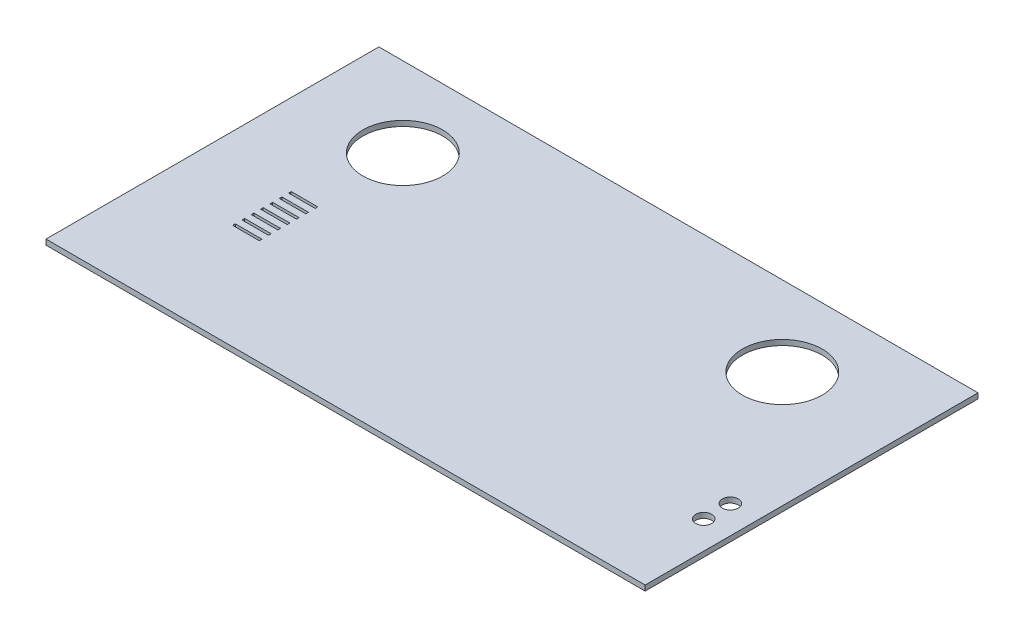
ISO-10303-21;
HEADER;
FILE_DESCRIPTION(('STEP AP214'),'2;1');
FILE_NAME('part.step','',(''),(''),'','','');
FILE_SCHEMA(('AUTOMOTIVE_DESIGN { 1 0 10303 214 1 1 1 1 }'));
ENDSEC;
DATA;
#1=APPLICATION_CONTEXT('core data for automotive mechanical design processes');
#2=APPLICATION_PROTOCOL_DEFINITION('international standard','automotive_design',2000,#1);
#3=PRODUCT_CONTEXT('',#1,'mechanical');
#4=PRODUCT('Part','Part','',(#3));
#5=PRODUCT_RELATED_PRODUCT_CATEGORY('part','',(#4));
#6=PRODUCT_DEFINITION_FORMATION('','',#4);
#7=PRODUCT_DEFINITION_CONTEXT('part definition',#1,'design');
#8=PRODUCT_DEFINITION('design','',#6,#7);
#9=PRODUCT_DEFINITION_SHAPE('','',#8);
#10=(LENGTH_UNIT() NAMED_UNIT(*) SI_UNIT(.MILLI.,.METRE.));
#11=(NAMED_UNIT(*) PLANE_ANGLE_UNIT() SI_UNIT($,.RADIAN.));
#12=(NAMED_UNIT(*) SI_UNIT($,.STERADIAN.) SOLID_ANGLE_UNIT());
#13=UNCERTAINTY_MEASURE_WITH_UNIT(LENGTH_MEASURE(1.E-05),#10,'distance_accuracy_value','');
#14=(GEOMETRIC_REPRESENTATION_CONTEXT(3) GLOBAL_UNCERTAINTY_ASSIGNED_CONTEXT((#13)) GLOBAL_UNIT_ASSIGNED_CONTEXT((#10,
#11,#12)) REPRESENTATION_CONTEXT('',''));
#15=CARTESIAN_POINT('',(0.,0.,0.));
#16=DIRECTION('',(0.,0.,1.));
#17=DIRECTION('',(1.,0.,0.));
#18=AXIS2_PLACEMENT_3D('',#15,#16,#17);
#19=CARTESIAN_POINT('',(0.,4.,0.));
#20=DIRECTION('',(0.,1.,0.));
#21=DIRECTION('',(0.,0.,1.));
#22=AXIS2_PLACEMENT_3D('',#19,#20,#21);
#23=PLANE('',#22);
#24=DIRECTION('',(0.,0.,1.));
#25=VECTOR('',#24,1.);
#26=CARTESIAN_POINT('',(61.17,4.,-123.));
#27=LINE('',#26,#25);
#28=CARTESIAN_POINT('',(61.17,4.,-123.));
#29=VERTEX_POINT('',#28);
#30=CARTESIAN_POINT('',(61.17,4.,-121.));
#31=VERTEX_POINT('',#30);
#32=EDGE_CURVE('E120',#29,#31,#27,.T.);
#33=ORIENTED_EDGE('',*,*,#32,.F.);
#34=DIRECTION('',(-1.,0.,0.));
#35=VECTOR('',#34,1.);
#36=CARTESIAN_POINT('',(81.17,4.,-123.));
#37=LINE('',#36,#35);
#38=CARTESIAN_POINT('',(81.17,4.,-123.));
#39=VERTEX_POINT('',#38);
#40=EDGE_CURVE('E428',#39,#29,#37,.T.);
#41=ORIENTED_EDGE('',*,*,#40,.F.);
#42=DIRECTION('',(0.,0.,-1.));
#43=VECTOR('',#42,1.);
#44=CARTESIAN_POINT('',(81.17,4.,-121.));
#45=LINE('',#44,#43);
#46=CARTESIAN_POINT('',(81.17,4.,-121.));
#47=VERTEX_POINT('',#46);
#48=EDGE_CURVE('E431',#47,#39,#45,.T.);
#49=ORIENTED_EDGE('',*,*,#48,.F.);
#50=DIRECTION('',(1.,0.,0.));
#51=VECTOR('',#50,1.);
#52=CARTESIAN_POINT('',(61.17,4.,-121.));
#53=LINE('',#52,#51);
#54=EDGE_CURVE('E435',#31,#47,#53,.T.);
#55=ORIENTED_EDGE('',*,*,#54,.F.);
#56=EDGE_LOOP('',(#33,#41,#49,#55));
#57=FACE_BOUND('',#56,.T.);
#58=DIRECTION('',(0.,0.,-1.));
#59=VECTOR('',#58,1.);
#60=CARTESIAN_POINT('',(81.17,4.,0.));
#61=LINE('',#60,#59);
#62=CARTESIAN_POINT('',(81.17,4.,-79.));
#63=VERTEX_POINT('',#62);
#64=CARTESIAN_POINT('',(81.17,4.,-81.));
#65=VERTEX_POINT('',#64);
#66=EDGE_CURVE('E128',#63,#65,#61,.T.);
#67=ORIENTED_EDGE('',*,*,#66,.F.);
#68=DIRECTION('',(1.,0.,0.));
#69=VECTOR('',#68,1.);
#70=CARTESIAN_POINT('',(0.,4.,-79.));
#71=LINE('',#70,#69);
#72=CARTESIAN_POINT('',(61.17,4.,-79.));
#73=VERTEX_POINT('',#72);
#74=EDGE_CURVE('E396',#73,#63,#71,.T.);
#75=ORIENTED_EDGE('',*,*,#74,.F.);
#76=DIRECTION('',(0.,0.,1.));
#77=VECTOR('',#76,1.);
#78=CARTESIAN_POINT('',(61.17,4.,0.));
#79=LINE('',#78,#77);
#80=CARTESIAN_POINT('',(61.17,4.,-81.));
#81=VERTEX_POINT('',#80);
#82=EDGE_CURVE('E399',#81,#73,#79,.T.);
#83=ORIENTED_EDGE('',*,*,#82,.F.);
#84=DIRECTION('',(-1.,0.,0.));
#85=VECTOR('',#84,1.);
#86=CARTESIAN_POINT('',(0.,4.,-81.));
#87=LINE('',#86,#85);
#88=EDGE_CURVE('E403',#65,#81,#87,.T.);
#89=ORIENTED_EDGE('',*,*,#88,.F.);
#90=EDGE_LOOP('',(#67,#75,#83,#89));
#91=FACE_BOUND('',#90,.T.);
#92=DIRECTION('',(1.,0.,0.));
#93=VECTOR('',#92,1.);
#94=CARTESIAN_POINT('',(0.,4.,-86.));
#95=LINE('',#94,#93);
#96=CARTESIAN_POINT('',(61.17,4.,-86.));
#97=VERTEX_POINT('',#96);
#98=CARTESIAN_POINT('',(81.17,4.,-86.));
#99=VERTEX_POINT('',#98);
#100=EDGE_CURVE('E459',#97,#99,#95,.T.);
#101=ORIENTED_EDGE('',*,*,#100,.F.);
#102=DIRECTION('',(0.,0.,1.));
#103=VECTOR('',#102,1.);
#104=CARTESIAN_POINT('',(61.17,4.,0.));
#105=LINE('',#104,#103);
#106=CARTESIAN_POINT('',(61.17,4.,-88.));
#107=VERTEX_POINT('',#106);
#108=EDGE_CURVE('E492',#107,#97,#105,.T.);
#109=ORIENTED_EDGE('',*,*,#108,.F.);
#110=DIRECTION('',(-1.,0.,0.));
#111=VECTOR('',#110,1.);
#112=CARTESIAN_POINT('',(0.,4.,-88.));
#113=LINE('',#112,#111);
#114=CARTESIAN_POINT('',(81.17,4.,-88.));
#115=VERTEX_POINT('',#114);
#116=EDGE_CURVE('E495',#115,#107,#113,.T.);
#117=ORIENTED_EDGE('',*,*,#116,.F.);
#118=DIRECTION('',(0.,0.,-1.));
#119=VECTOR('',#118,1.);
#120=CARTESIAN_POINT('',(81.17,4.,0.));
#121=LINE('',#120,#119);
#122=EDGE_CURVE('E499',#99,#115,#121,.T.);
#123=ORIENTED_EDGE('',*,*,#122,.F.);
#124=EDGE_LOOP('',(#101,#109,#117,#123));
#125=FACE_BOUND('',#124,.T.);
#126=DIRECTION('',(1.,0.,0.));
#127=VECTOR('',#126,1.);
#128=CARTESIAN_POINT('',(0.,4.,-100.));
#129=LINE('',#128,#127);
#130=CARTESIAN_POINT('',(61.17,4.,-100.));
#131=VERTEX_POINT('',#130);
#132=CARTESIAN_POINT('',(81.17,4.,-100.));
#133=VERTEX_POINT('',#132);
#134=EDGE_CURVE('E460',#131,#133,#129,.T.);
#135=ORIENTED_EDGE('',*,*,#134,.F.);
#136=DIRECTION('',(0.,0.,1.));
#137=VECTOR('',#136,1.);
#138=CARTESIAN_POINT('',(61.17,4.,0.));
#139=LINE('',#138,#137);
#140=CARTESIAN_POINT('',(61.17,4.,-102.));
#141=VERTEX_POINT('',#140);
#142=EDGE_CURVE('E462',#141,#131,#139,.T.);
#143=ORIENTED_EDGE('',*,*,#142,.F.);
#144=DIRECTION('',(-1.,0.,0.));
#145=VECTOR('',#144,1.);
#146=CARTESIAN_POINT('',(0.,4.,-102.));
#147=LINE('',#146,#145);
#148=CARTESIAN_POINT('',(81.17,4.,-102.));
#149=VERTEX_POINT('',#148);
#150=EDGE_CURVE('E466',#149,#141,#147,.T.);
#151=ORIENTED_EDGE('',*,*,#150,.F.);
#152=DIRECTION('',(0.,0.,-1.));
#153=VECTOR('',#152,1.);
#154=CARTESIAN_POINT('',(81.17,4.,0.));
#155=LINE('',#154,#153);
#156=EDGE_CURVE('E469',#133,#149,#155,.T.);
#157=ORIENTED_EDGE('',*,*,#156,.F.);
#158=EDGE_LOOP('',(#135,#143,#151,#157));
#159=FACE_BOUND('',#158,.T.);
#160=CARTESIAN_POINT('',(429.,4.,-85.));
#161=DIRECTION('',(0.,1.,0.));
#162=DIRECTION('',(0.,0.,1.));
#163=AXIS2_PLACEMENT_3D('',#160,#161,#162);
#164=CIRCLE('',#163,5.99999999999999);
#165=CARTESIAN_POINT('',(429.,4.,-79.0000000000001));
#166=VERTEX_POINT('',#165);
#167=EDGE_CURVE('E427',#166,#166,#164,.T.);
#168=ORIENTED_EDGE('',*,*,#167,.F.);
#169=EDGE_LOOP('',(#168));
#170=FACE_BOUND('',#169,.T.);
#171=CARTESIAN_POINT('',(429.,4.,-65.));
#172=DIRECTION('',(0.,1.,0.));
#173=DIRECTION('',(0.,0.,1.));
#174=AXIS2_PLACEMENT_3D('',#171,#172,#173);
#175=CIRCLE('',#174,5.99999999999999);
#176=CARTESIAN_POINT('',(429.,4.,-59.));
#177=VERTEX_POINT('',#176);
#178=EDGE_CURVE('E342',#177,#177,#175,.T.);
#179=ORIENTED_EDGE('',*,*,#178,.F.);
#180=EDGE_LOOP('',(#179));
#181=FACE_BOUND('',#180,.T.);
#182=DIRECTION('',(1.,0.,0.));
#183=VECTOR('',#182,1.);
#184=CARTESIAN_POINT('',(61.17,4.,-114.));
#185=LINE('',#184,#183);
#186=CARTESIAN_POINT('',(61.17,4.,-114.));
#187=VERTEX_POINT('',#186);
#188=CARTESIAN_POINT('',(81.17,4.,-114.));
#189=VERTEX_POINT('',#188);
#190=EDGE_CURVE('E365',#187,#189,#185,.T.);
#191=ORIENTED_EDGE('',*,*,#190,.F.);
#192=DIRECTION('',(0.,0.,1.));
#193=VECTOR('',#192,1.);
#194=CARTESIAN_POINT('',(61.17,4.,0.));
#195=LINE('',#194,#193);
#196=CARTESIAN_POINT('',(61.17,4.,-116.));
#197=VERTEX_POINT('',#196);
#198=EDGE_CURVE('E361',#197,#187,#195,.T.);
#199=ORIENTED_EDGE('',*,*,#198,.F.);
#200=DIRECTION('',(-1.,0.,0.));
#201=VECTOR('',#200,1.);
#202=CARTESIAN_POINT('',(81.17,4.,-116.));
#203=LINE('',#202,#201);
#204=CARTESIAN_POINT('',(81.17,4.,-116.));
#205=VERTEX_POINT('',#204);
#206=EDGE_CURVE('E334',#205,#197,#203,.T.);
#207=ORIENTED_EDGE('',*,*,#206,.F.);
#208=DIRECTION('',(0.,0.,-1.));
#209=VECTOR('',#208,1.);
#210=CARTESIAN_POINT('',(81.17,4.,-114.));
#211=LINE('',#210,#209);
#212=EDGE_CURVE('E362',#189,#205,#211,.T.);
#213=ORIENTED_EDGE('',*,*,#212,.F.);
#214=EDGE_LOOP('',(#191,#199,#207,#213));
#215=FACE_BOUND('',#214,.T.);
#216=DIRECTION('',(0.,0.,1.));
#217=VECTOR('',#216,1.);
#218=CARTESIAN_POINT('',(61.17,4.,-95.));
#219=LINE('',#218,#217);
#220=CARTESIAN_POINT('',(61.17,4.,-95.));
#221=VERTEX_POINT('',#220);
#222=CARTESIAN_POINT('',(61.17,4.,-93.));
#223=VERTEX_POINT('',#222);
#224=EDGE_CURVE('E472',#221,#223,#219,.T.);
#225=ORIENTED_EDGE('',*,*,#224,.F.);
#226=DIRECTION('',(-1.,0.,0.));
#227=VECTOR('',#226,1.);
#228=CARTESIAN_POINT('',(0.,4.,-95.));
#229=LINE('',#228,#227);
#230=CARTESIAN_POINT('',(81.17,4.,-95.));
#231=VERTEX_POINT('',#230);
#232=EDGE_CURVE('E517',#231,#221,#229,.T.);
#233=ORIENTED_EDGE('',*,*,#232,.F.);
#234=DIRECTION('',(0.,0.,-1.));
#235=VECTOR('',#234,1.);
#236=CARTESIAN_POINT('',(81.17,4.,-93.));
#237=LINE('',#236,#235);
#238=CARTESIAN_POINT('',(81.17,4.,-93.));
#239=VERTEX_POINT('',#238);
#240=EDGE_CURVE('E530',#239,#231,#237,.T.);
#241=ORIENTED_EDGE('',*,*,#240,.F.);
#242=DIRECTION('',(1.,0.,0.));
#243=VECTOR('',#242,1.);
#244=CARTESIAN_POINT('',(0.,4.,-93.));
#245=LINE('',#244,#243);
#246=EDGE_CURVE('E521',#223,#239,#245,.T.);
#247=ORIENTED_EDGE('',*,*,#246,.F.);
#248=EDGE_LOOP('',(#225,#233,#241,#247));
#249=FACE_BOUND('',#248,.T.);
#250=CARTESIAN_POINT('',(78.,4.,-190.));
#251=DIRECTION('',(0.,1.,0.));
#252=DIRECTION('',(0.,0.,1.));
#253=AXIS2_PLACEMENT_3D('',#250,#251,#252);
#254=CIRCLE('',#253,30.);
#255=CARTESIAN_POINT('',(78.,4.,-160.));
#256=VERTEX_POINT('',#255);
#257=EDGE_CURVE('E549',#256,#256,#254,.T.);
#258=ORIENTED_EDGE('',*,*,#257,.F.);
#259=EDGE_LOOP('',(#258));
#260=FACE_BOUND('',#259,.T.);
#261=CARTESIAN_POINT('',(363.,4.,-190.));
#262=DIRECTION('',(0.,1.,0.));
#263=DIRECTION('',(0.,0.,1.));
#264=AXIS2_PLACEMENT_3D('',#261,#262,#263);
#265=CIRCLE('',#264,30.);
#266=CARTESIAN_POINT('',(363.,4.,-160.));
#267=VERTEX_POINT('',#266);
#268=EDGE_CURVE('E520',#267,#267,#265,.T.);
#269=ORIENTED_EDGE('',*,*,#268,.F.);
#270=EDGE_LOOP('',(#269));
#271=FACE_BOUND('',#270,.T.);
#272=DIRECTION('',(0.,0.,1.));
#273=VECTOR('',#272,1.);
#274=CARTESIAN_POINT('',(0.,4.,-250.));
#275=LINE('',#274,#273);
#276=CARTESIAN_POINT('',(0.,4.,-250.));
#277=VERTEX_POINT('',#276);
#278=CARTESIAN_POINT('',(0.,4.,0.));
#279=VERTEX_POINT('',#278);
#280=EDGE_CURVE('E557',#277,#279,#275,.T.);
#281=ORIENTED_EDGE('',*,*,#280,.T.);
#282=DIRECTION('',(1.,0.,0.));
#283=VECTOR('',#282,1.);
#284=CARTESIAN_POINT('',(0.,4.,0.));
#285=LINE('',#284,#283);
#286=CARTESIAN_POINT('',(450.,4.,0.));
#287=VERTEX_POINT('',#286);
#288=EDGE_CURVE('E560',#279,#287,#285,.T.);
#289=ORIENTED_EDGE('',*,*,#288,.T.);
#290=DIRECTION('',(0.,0.,-1.));
#291=VECTOR('',#290,1.);
#292=CARTESIAN_POINT('',(450.,4.,0.));
#293=LINE('',#292,#291);
#294=CARTESIAN_POINT('',(450.,4.,-250.));
#295=VERTEX_POINT('',#294);
#296=EDGE_CURVE('E563',#287,#295,#293,.T.);
#297=ORIENTED_EDGE('',*,*,#296,.T.);
#298=DIRECTION('',(-1.,0.,0.));
#299=VECTOR('',#298,1.);
#300=CARTESIAN_POINT('',(450.,4.,-250.));
#301=LINE('',#300,#299);
#302=EDGE_CURVE('E565',#295,#277,#301,.T.);
#303=ORIENTED_EDGE('',*,*,#302,.T.);
#304=EDGE_LOOP('',(#281,#289,#297,#303));
#305=FACE_BOUND('',#304,.T.);
#306=DIRECTION('',(0.,0.,1.));
#307=VECTOR('',#306,1.);
#308=CARTESIAN_POINT('',(81.17,4.,0.));
#309=LINE('',#308,#307);
#310=CARTESIAN_POINT('',(81.17,4.,-109.));
#311=VERTEX_POINT('',#310);
#312=CARTESIAN_POINT('',(81.17,4.,-107.));
#313=VERTEX_POINT('',#312);
#314=EDGE_CURVE('E338',#311,#313,#309,.T.);
#315=ORIENTED_EDGE('',*,*,#314,.T.);
#316=DIRECTION('',(-1.,0.,0.));
#317=VECTOR('',#316,1.);
#318=CARTESIAN_POINT('',(0.,4.,-107.));
#319=LINE('',#318,#317);
#320=CARTESIAN_POINT('',(61.17,4.,-107.));
#321=VERTEX_POINT('',#320);
#322=EDGE_CURVE('E331',#313,#321,#319,.T.);
#323=ORIENTED_EDGE('',*,*,#322,.T.);
#324=DIRECTION('',(0.,0.,-1.));
#325=VECTOR('',#324,1.);
#326=CARTESIAN_POINT('',(61.17,4.,0.));
#327=LINE('',#326,#325);
#328=CARTESIAN_POINT('',(61.17,4.,-109.));
#329=VERTEX_POINT('',#328);
#330=EDGE_CURVE('E314',#321,#329,#327,.T.);
#331=ORIENTED_EDGE('',*,*,#330,.T.);
#332=DIRECTION('',(1.,0.,0.));
#333=VECTOR('',#332,1.);
#334=CARTESIAN_POINT('',(0.,4.,-109.));
#335=LINE('',#334,#333);
#336=EDGE_CURVE('E325',#329,#311,#335,.T.);
#337=ORIENTED_EDGE('',*,*,#336,.T.);
#338=EDGE_LOOP('',(#315,#323,#331,#337));
#339=FACE_BOUND('',#338,.T.);
#340=ADVANCED_FACE('F105',(#57,#91,#125,#159,#170,#181,#215,#249,#260,#271,#305,#339),#23,.T.);
#341=CARTESIAN_POINT('',(0.,0.,0.));
#342=DIRECTION('',(0.,1.,0.));
#343=DIRECTION('',(0.,0.,1.));
#344=AXIS2_PLACEMENT_3D('',#341,#342,#343);
#345=PLANE('',#344);
#346=DIRECTION('',(-1.,0.,0.));
#347=VECTOR('',#346,1.);
#348=CARTESIAN_POINT('',(81.17,0.,-123.));
#349=LINE('',#348,#347);
#350=CARTESIAN_POINT('',(81.17,0.,-123.));
#351=VERTEX_POINT('',#350);
#352=CARTESIAN_POINT('',(61.17,0.,-123.));
#353=VERTEX_POINT('',#352);
#354=EDGE_CURVE('E420',#351,#353,#349,.T.);
#355=ORIENTED_EDGE('',*,*,#354,.T.);
#356=DIRECTION('',(0.,0.,1.));
#357=VECTOR('',#356,1.);
#358=CARTESIAN_POINT('',(61.17,0.,-123.));
#359=LINE('',#358,#357);
#360=CARTESIAN_POINT('',(61.17,0.,-121.));
#361=VERTEX_POINT('',#360);
#362=EDGE_CURVE('E432',#353,#361,#359,.T.);
#363=ORIENTED_EDGE('',*,*,#362,.T.);
#364=DIRECTION('',(1.,0.,0.));
#365=VECTOR('',#364,1.);
#366=CARTESIAN_POINT('',(61.17,0.,-121.));
#367=LINE('',#366,#365);
#368=CARTESIAN_POINT('',(81.17,0.,-121.));
#369=VERTEX_POINT('',#368);
#370=EDGE_CURVE('E444',#361,#369,#367,.T.);
#371=ORIENTED_EDGE('',*,*,#370,.T.);
#372=DIRECTION('',(0.,0.,-1.));
#373=VECTOR('',#372,1.);
#374=CARTESIAN_POINT('',(81.17,0.,-121.));
#375=LINE('',#374,#373);
#376=EDGE_CURVE('E441',#369,#351,#375,.T.);
#377=ORIENTED_EDGE('',*,*,#376,.T.);
#378=EDGE_LOOP('',(#355,#363,#371,#377));
#379=FACE_BOUND('',#378,.T.);
#380=DIRECTION('',(1.,0.,0.));
#381=VECTOR('',#380,1.);
#382=CARTESIAN_POINT('',(0.,0.,-79.));
#383=LINE('',#382,#381);
#384=CARTESIAN_POINT('',(61.17,0.,-79.));
#385=VERTEX_POINT('',#384);
#386=CARTESIAN_POINT('',(81.17,0.,-79.));
#387=VERTEX_POINT('',#386);
#388=EDGE_CURVE('E389',#385,#387,#383,.T.);
#389=ORIENTED_EDGE('',*,*,#388,.T.);
#390=DIRECTION('',(0.,0.,-1.));
#391=VECTOR('',#390,1.);
#392=CARTESIAN_POINT('',(81.17,0.,0.));
#393=LINE('',#392,#391);
#394=CARTESIAN_POINT('',(81.17,0.,-81.));
#395=VERTEX_POINT('',#394);
#396=EDGE_CURVE('E400',#387,#395,#393,.T.);
#397=ORIENTED_EDGE('',*,*,#396,.T.);
#398=DIRECTION('',(-1.,0.,0.));
#399=VECTOR('',#398,1.);
#400=CARTESIAN_POINT('',(0.,0.,-81.));
#401=LINE('',#400,#399);
#402=CARTESIAN_POINT('',(61.17,0.,-81.));
#403=VERTEX_POINT('',#402);
#404=EDGE_CURVE('E413',#395,#403,#401,.T.);
#405=ORIENTED_EDGE('',*,*,#404,.T.);
#406=DIRECTION('',(0.,0.,1.));
#407=VECTOR('',#406,1.);
#408=CARTESIAN_POINT('',(61.17,0.,0.));
#409=LINE('',#408,#407);
#410=EDGE_CURVE('E410',#403,#385,#409,.T.);
#411=ORIENTED_EDGE('',*,*,#410,.T.);
#412=EDGE_LOOP('',(#389,#397,#405,#411));
#413=FACE_BOUND('',#412,.T.);
#414=DIRECTION('',(0.,0.,1.));
#415=VECTOR('',#414,1.);
#416=CARTESIAN_POINT('',(61.17,0.,0.));
#417=LINE('',#416,#415);
#418=CARTESIAN_POINT('',(61.17,0.,-88.));
#419=VERTEX_POINT('',#418);
#420=CARTESIAN_POINT('',(61.17,0.,-86.));
#421=VERTEX_POINT('',#420);
#422=EDGE_CURVE('E486',#419,#421,#417,.T.);
#423=ORIENTED_EDGE('',*,*,#422,.T.);
#424=DIRECTION('',(1.,0.,0.));
#425=VECTOR('',#424,1.);
#426=CARTESIAN_POINT('',(0.,0.,-86.));
#427=LINE('',#426,#425);
#428=CARTESIAN_POINT('',(81.17,0.,-86.));
#429=VERTEX_POINT('',#428);
#430=EDGE_CURVE('E496',#421,#429,#427,.T.);
#431=ORIENTED_EDGE('',*,*,#430,.T.);
#432=DIRECTION('',(0.,0.,-1.));
#433=VECTOR('',#432,1.);
#434=CARTESIAN_POINT('',(81.17,0.,0.));
#435=LINE('',#434,#433);
#436=CARTESIAN_POINT('',(81.17,0.,-88.));
#437=VERTEX_POINT('',#436);
#438=EDGE_CURVE('E508',#429,#437,#435,.T.);
#439=ORIENTED_EDGE('',*,*,#438,.T.);
#440=DIRECTION('',(-1.,0.,0.));
#441=VECTOR('',#440,1.);
#442=CARTESIAN_POINT('',(0.,0.,-88.));
#443=LINE('',#442,#441);
#444=EDGE_CURVE('E505',#437,#419,#443,.T.);
#445=ORIENTED_EDGE('',*,*,#444,.T.);
#446=EDGE_LOOP('',(#423,#431,#439,#445));
#447=FACE_BOUND('',#446,.T.);
#448=DIRECTION('',(0.,0.,1.));
#449=VECTOR('',#448,1.);
#450=CARTESIAN_POINT('',(61.17,0.,0.));
#451=LINE('',#450,#449);
#452=CARTESIAN_POINT('',(61.17,0.,-102.));
#453=VERTEX_POINT('',#452);
#454=CARTESIAN_POINT('',(61.17,0.,-100.));
#455=VERTEX_POINT('',#454);
#456=EDGE_CURVE('E475',#453,#455,#451,.T.);
#457=ORIENTED_EDGE('',*,*,#456,.T.);
#458=DIRECTION('',(1.,0.,0.));
#459=VECTOR('',#458,1.);
#460=CARTESIAN_POINT('',(0.,0.,-100.));
#461=LINE('',#460,#459);
#462=CARTESIAN_POINT('',(81.17,0.,-100.));
#463=VERTEX_POINT('',#462);
#464=EDGE_CURVE('E451',#455,#463,#461,.T.);
#465=ORIENTED_EDGE('',*,*,#464,.T.);
#466=DIRECTION('',(0.,0.,-1.));
#467=VECTOR('',#466,1.);
#468=CARTESIAN_POINT('',(81.17,0.,0.));
#469=LINE('',#468,#467);
#470=CARTESIAN_POINT('',(81.17,0.,-102.));
#471=VERTEX_POINT('',#470);
#472=EDGE_CURVE('E463',#463,#471,#469,.T.);
#473=ORIENTED_EDGE('',*,*,#472,.T.);
#474=DIRECTION('',(-1.,0.,0.));
#475=VECTOR('',#474,1.);
#476=CARTESIAN_POINT('',(0.,0.,-102.));
#477=LINE('',#476,#475);
#478=EDGE_CURVE('E478',#471,#453,#477,.T.);
#479=ORIENTED_EDGE('',*,*,#478,.T.);
#480=EDGE_LOOP('',(#457,#465,#473,#479));
#481=FACE_BOUND('',#480,.T.);
#482=CARTESIAN_POINT('',(429.,0.,-85.));
#483=DIRECTION('',(0.,1.,0.));
#484=DIRECTION('',(0.,0.,1.));
#485=AXIS2_PLACEMENT_3D('',#482,#483,#484);
#486=CIRCLE('',#485,5.99999999999999);
#487=CARTESIAN_POINT('',(429.,0.,-79.0000000000001));
#488=VERTEX_POINT('',#487);
#489=EDGE_CURVE('E654',#488,#488,#486,.T.);
#490=ORIENTED_EDGE('',*,*,#489,.T.);
#491=EDGE_LOOP('',(#490));
#492=FACE_BOUND('',#491,.T.);
#493=CARTESIAN_POINT('',(429.,0.,-65.));
#494=DIRECTION('',(0.,1.,0.));
#495=DIRECTION('',(0.,0.,1.));
#496=AXIS2_PLACEMENT_3D('',#493,#494,#495);
#497=CIRCLE('',#496,5.99999999999999);
#498=CARTESIAN_POINT('',(429.,0.,-59.));
#499=VERTEX_POINT('',#498);
#500=EDGE_CURVE('E339',#499,#499,#497,.T.);
#501=ORIENTED_EDGE('',*,*,#500,.T.);
#502=EDGE_LOOP('',(#501));
#503=FACE_BOUND('',#502,.T.);
#504=DIRECTION('',(0.,0.,1.));
#505=VECTOR('',#504,1.);
#506=CARTESIAN_POINT('',(0.,0.,-250.));
#507=LINE('',#506,#505);
#508=CARTESIAN_POINT('',(0.,0.,-250.));
#509=VERTEX_POINT('',#508);
#510=CARTESIAN_POINT('',(0.,0.,0.));
#511=VERTEX_POINT('',#510);
#512=EDGE_CURVE('E548',#509,#511,#507,.T.);
#513=ORIENTED_EDGE('',*,*,#512,.F.);
#514=DIRECTION('',(-1.,0.,0.));
#515=VECTOR('',#514,1.);
#516=CARTESIAN_POINT('',(450.,0.,-250.));
#517=LINE('',#516,#515);
#518=CARTESIAN_POINT('',(450.,0.,-250.));
#519=VERTEX_POINT('',#518);
#520=EDGE_CURVE('E561',#519,#509,#517,.T.);
#521=ORIENTED_EDGE('',*,*,#520,.F.);
#522=DIRECTION('',(0.,0.,-1.));
#523=VECTOR('',#522,1.);
#524=CARTESIAN_POINT('',(450.,0.,0.));
#525=LINE('',#524,#523);
#526=CARTESIAN_POINT('',(450.,0.,0.));
#527=VERTEX_POINT('',#526);
#528=EDGE_CURVE('E572',#527,#519,#525,.T.);
#529=ORIENTED_EDGE('',*,*,#528,.F.);
#530=DIRECTION('',(1.,0.,0.));
#531=VECTOR('',#530,1.);
#532=CARTESIAN_POINT('',(0.,0.,0.));
#533=LINE('',#532,#531);
#534=EDGE_CURVE('E570',#511,#527,#533,.T.);
#535=ORIENTED_EDGE('',*,*,#534,.F.);
#536=EDGE_LOOP('',(#513,#521,#529,#535));
#537=FACE_BOUND('',#536,.T.);
#538=CARTESIAN_POINT('',(363.,0.,-190.));
#539=DIRECTION('',(0.,1.,0.));
#540=DIRECTION('',(0.,0.,1.));
#541=AXIS2_PLACEMENT_3D('',#538,#539,#540);
#542=CIRCLE('',#541,30.);
#543=CARTESIAN_POINT('',(363.,0.,-160.));
#544=VERTEX_POINT('',#543);
#545=EDGE_CURVE('E552',#544,#544,#542,.T.);
#546=ORIENTED_EDGE('',*,*,#545,.T.);
#547=EDGE_LOOP('',(#546));
#548=FACE_BOUND('',#547,.T.);
#549=CARTESIAN_POINT('',(78.,0.,-190.));
#550=DIRECTION('',(0.,1.,0.));
#551=DIRECTION('',(0.,0.,1.));
#552=AXIS2_PLACEMENT_3D('',#549,#550,#551);
#553=CIRCLE('',#552,30.);
#554=CARTESIAN_POINT('',(78.,0.,-160.));
#555=VERTEX_POINT('',#554);
#556=EDGE_CURVE('E545',#555,#555,#553,.T.);
#557=ORIENTED_EDGE('',*,*,#556,.T.);
#558=EDGE_LOOP('',(#557));
#559=FACE_BOUND('',#558,.T.);
#560=DIRECTION('',(-1.,0.,0.));
#561=VECTOR('',#560,1.);
#562=CARTESIAN_POINT('',(0.,0.,-95.));
#563=LINE('',#562,#561);
#564=CARTESIAN_POINT('',(81.17,0.,-95.));
#565=VERTEX_POINT('',#564);
#566=CARTESIAN_POINT('',(61.17,0.,-95.));
#567=VERTEX_POINT('',#566);
#568=EDGE_CURVE('E516',#565,#567,#563,.T.);
#569=ORIENTED_EDGE('',*,*,#568,.T.);
#570=DIRECTION('',(0.,0.,1.));
#571=VECTOR('',#570,1.);
#572=CARTESIAN_POINT('',(61.17,0.,-95.));
#573=LINE('',#572,#571);
#574=CARTESIAN_POINT('',(61.17,0.,-93.));
#575=VERTEX_POINT('',#574);
#576=EDGE_CURVE('E526',#567,#575,#573,.T.);
#577=ORIENTED_EDGE('',*,*,#576,.T.);
#578=DIRECTION('',(1.,0.,0.));
#579=VECTOR('',#578,1.);
#580=CARTESIAN_POINT('',(0.,0.,-93.));
#581=LINE('',#580,#579);
#582=CARTESIAN_POINT('',(81.17,0.,-93.));
#583=VERTEX_POINT('',#582);
#584=EDGE_CURVE('E513',#575,#583,#581,.T.);
#585=ORIENTED_EDGE('',*,*,#584,.T.);
#586=DIRECTION('',(0.,0.,-1.));
#587=VECTOR('',#586,1.);
#588=CARTESIAN_POINT('',(81.17,0.,-93.));
#589=LINE('',#588,#587);
#590=EDGE_CURVE('E529',#583,#565,#589,.T.);
#591=ORIENTED_EDGE('',*,*,#590,.T.);
#592=EDGE_LOOP('',(#569,#577,#585,#591));
#593=FACE_BOUND('',#592,.T.);
#594=DIRECTION('',(0.,0.,1.));
#595=VECTOR('',#594,1.);
#596=CARTESIAN_POINT('',(61.17,0.,0.));
#597=LINE('',#596,#595);
#598=CARTESIAN_POINT('',(61.17,0.,-116.));
#599=VERTEX_POINT('',#598);
#600=CARTESIAN_POINT('',(61.17,0.,-114.));
#601=VERTEX_POINT('',#600);
#602=EDGE_CURVE('E380',#599,#601,#597,.T.);
#603=ORIENTED_EDGE('',*,*,#602,.T.);
#604=DIRECTION('',(1.,0.,0.));
#605=VECTOR('',#604,1.);
#606=CARTESIAN_POINT('',(61.17,0.,-114.));
#607=LINE('',#606,#605);
#608=CARTESIAN_POINT('',(81.17,0.,-114.));
#609=VERTEX_POINT('',#608);
#610=EDGE_CURVE('E372',#601,#609,#607,.T.);
#611=ORIENTED_EDGE('',*,*,#610,.T.);
#612=DIRECTION('',(0.,0.,-1.));
#613=VECTOR('',#612,1.);
#614=CARTESIAN_POINT('',(81.17,0.,-114.));
#615=LINE('',#614,#613);
#616=CARTESIAN_POINT('',(81.17,0.,-116.));
#617=VERTEX_POINT('',#616);
#618=EDGE_CURVE('E358',#609,#617,#615,.T.);
#619=ORIENTED_EDGE('',*,*,#618,.T.);
#620=DIRECTION('',(-1.,0.,0.));
#621=VECTOR('',#620,1.);
#622=CARTESIAN_POINT('',(81.17,0.,-116.));
#623=LINE('',#622,#621);
#624=EDGE_CURVE('E366',#617,#599,#623,.T.);
#625=ORIENTED_EDGE('',*,*,#624,.T.);
#626=EDGE_LOOP('',(#603,#611,#619,#625));
#627=FACE_BOUND('',#626,.T.);
#628=DIRECTION('',(-1.,0.,0.));
#629=VECTOR('',#628,1.);
#630=CARTESIAN_POINT('',(0.,0.,-107.));
#631=LINE('',#630,#629);
#632=CARTESIAN_POINT('',(81.17,0.,-107.));
#633=VERTEX_POINT('',#632);
#634=CARTESIAN_POINT('',(61.17,0.,-107.));
#635=VERTEX_POINT('',#634);
#636=EDGE_CURVE('E326',#633,#635,#631,.T.);
#637=ORIENTED_EDGE('',*,*,#636,.F.);
#638=DIRECTION('',(0.,0.,1.));
#639=VECTOR('',#638,1.);
#640=CARTESIAN_POINT('',(81.17,0.,0.));
#641=LINE('',#640,#639);
#642=CARTESIAN_POINT('',(81.17,0.,-109.));
#643=VERTEX_POINT('',#642);
#644=EDGE_CURVE('E353',#643,#633,#641,.T.);
#645=ORIENTED_EDGE('',*,*,#644,.F.);
#646=DIRECTION('',(1.,0.,0.));
#647=VECTOR('',#646,1.);
#648=CARTESIAN_POINT('',(0.,0.,-109.));
#649=LINE('',#648,#647);
#650=CARTESIAN_POINT('',(61.17,0.,-109.));
#651=VERTEX_POINT('',#650);
#652=EDGE_CURVE('E349',#651,#643,#649,.T.);
#653=ORIENTED_EDGE('',*,*,#652,.F.);
#654=DIRECTION('',(0.,0.,-1.));
#655=VECTOR('',#654,1.);
#656=CARTESIAN_POINT('',(61.17,0.,0.));
#657=LINE('',#656,#655);
#658=EDGE_CURVE('E347',#635,#651,#657,.T.);
#659=ORIENTED_EDGE('',*,*,#658,.F.);
#660=EDGE_LOOP('',(#637,#645,#653,#659));
#661=FACE_BOUND('',#660,.T.);
#662=ADVANCED_FACE('F590',(#379,#413,#447,#481,#492,#503,#537,#548,#559,#593,#627,#661),#345,.F.);
#663=CARTESIAN_POINT('',(0.,4.,-250.));
#664=DIRECTION('',(1.,0.,0.));
#665=DIRECTION('',(0.,0.,-1.));
#666=AXIS2_PLACEMENT_3D('',#663,#664,#665);
#667=PLANE('',#666);
#668=ORIENTED_EDGE('',*,*,#512,.T.);
#669=DIRECTION('',(0.,-1.,0.));
#670=VECTOR('',#669,1.);
#671=CARTESIAN_POINT('',(0.,4.,0.));
#672=LINE('',#671,#670);
#673=EDGE_CURVE('E12',#279,#511,#672,.T.);
#674=ORIENTED_EDGE('',*,*,#673,.F.);
#675=ORIENTED_EDGE('',*,*,#280,.F.);
#676=DIRECTION('',(0.,-1.,0.));
#677=VECTOR('',#676,1.);
#678=CARTESIAN_POINT('',(0.,4.,-250.));
#679=LINE('',#678,#677);
#680=EDGE_CURVE('E567',#277,#509,#679,.T.);
#681=ORIENTED_EDGE('',*,*,#680,.T.);
#682=EDGE_LOOP('',(#668,#674,#675,#681));
#683=FACE_BOUND('',#682,.T.);
#684=ADVANCED_FACE('F107',(#683),#667,.F.);
#685=CARTESIAN_POINT('',(0.,4.,0.));
#686=DIRECTION('',(0.,0.,-1.));
#687=DIRECTION('',(-1.,0.,0.));
#688=AXIS2_PLACEMENT_3D('',#685,#686,#687);
#689=PLANE('',#688);
#690=ORIENTED_EDGE('',*,*,#534,.T.);
#691=DIRECTION('',(0.,-1.,0.));
#692=VECTOR('',#691,1.);
#693=CARTESIAN_POINT('',(450.,4.,0.));
#694=LINE('',#693,#692);
#695=EDGE_CURVE('E113',#287,#527,#694,.T.);
#696=ORIENTED_EDGE('',*,*,#695,.F.);
#697=ORIENTED_EDGE('',*,*,#288,.F.);
#698=ORIENTED_EDGE('',*,*,#673,.T.);
#699=EDGE_LOOP('',(#690,#696,#697,#698));
#700=FACE_BOUND('',#699,.T.);
#701=ADVANCED_FACE('F600',(#700),#689,.F.);
#702=CARTESIAN_POINT('',(450.,4.,0.));
#703=DIRECTION('',(-1.,0.,0.));
#704=DIRECTION('',(0.,0.,1.));
#705=AXIS2_PLACEMENT_3D('',#702,#703,#704);
#706=PLANE('',#705);
#707=ORIENTED_EDGE('',*,*,#528,.T.);
#708=DIRECTION('',(0.,-1.,0.));
#709=VECTOR('',#708,1.);
#710=CARTESIAN_POINT('',(450.,4.,-250.));
#711=LINE('',#710,#709);
#712=EDGE_CURVE('E577',#295,#519,#711,.T.);
#713=ORIENTED_EDGE('',*,*,#712,.F.);
#714=ORIENTED_EDGE('',*,*,#296,.F.);
#715=ORIENTED_EDGE('',*,*,#695,.T.);
#716=EDGE_LOOP('',(#707,#713,#714,#715));
#717=FACE_BOUND('',#716,.T.);
#718=ADVANCED_FACE('F584',(#717),#706,.F.);
#719=CARTESIAN_POINT('',(450.,4.,-250.));
#720=DIRECTION('',(0.,0.,1.));
#721=DIRECTION('',(1.,0.,0.));
#722=AXIS2_PLACEMENT_3D('',#719,#720,#721);
#723=PLANE('',#722);
#724=ORIENTED_EDGE('',*,*,#520,.T.);
#725=ORIENTED_EDGE('',*,*,#680,.F.);
#726=ORIENTED_EDGE('',*,*,#302,.F.);
#727=ORIENTED_EDGE('',*,*,#712,.T.);
#728=EDGE_LOOP('',(#724,#725,#726,#727));
#729=FACE_BOUND('',#728,.T.);
#730=ADVANCED_FACE('F594',(#729),#723,.F.);
#731=CARTESIAN_POINT('',(363.,0.,-190.));
#732=DIRECTION('',(0.,1.,0.));
#733=DIRECTION('',(0.,0.,1.));
#734=AXIS2_PLACEMENT_3D('',#731,#732,#733);
#735=CYLINDRICAL_SURFACE('',#734,30.);
#736=ORIENTED_EDGE('',*,*,#545,.F.);
#737=EDGE_LOOP('',(#736));
#738=FACE_BOUND('',#737,.T.);
#739=ORIENTED_EDGE('',*,*,#268,.T.);
#740=EDGE_LOOP('',(#739));
#741=FACE_BOUND('',#740,.T.);
#742=ADVANCED_FACE('F618',(#738,#741),#735,.F.);
#743=CARTESIAN_POINT('',(78.,0.,-190.));
#744=DIRECTION('',(0.,1.,0.));
#745=DIRECTION('',(0.,0.,1.));
#746=AXIS2_PLACEMENT_3D('',#743,#744,#745);
#747=CYLINDRICAL_SURFACE('',#746,30.);
#748=ORIENTED_EDGE('',*,*,#556,.F.);
#749=EDGE_LOOP('',(#748));
#750=FACE_BOUND('',#749,.T.);
#751=ORIENTED_EDGE('',*,*,#257,.T.);
#752=EDGE_LOOP('',(#751));
#753=FACE_BOUND('',#752,.T.);
#754=ADVANCED_FACE('F625',(#750,#753),#747,.F.);
#755=CARTESIAN_POINT('',(0.,0.,-93.));
#756=DIRECTION('',(0.,0.,1.));
#757=DIRECTION('',(1.,0.,0.));
#758=AXIS2_PLACEMENT_3D('',#755,#756,#757);
#759=PLANE('',#758);
#760=ORIENTED_EDGE('',*,*,#246,.T.);
#761=DIRECTION('',(0.,1.,0.));
#762=VECTOR('',#761,1.);
#763=CARTESIAN_POINT('',(81.17,0.,-93.));
#764=LINE('',#763,#762);
#765=EDGE_CURVE('E539',#583,#239,#764,.T.);
#766=ORIENTED_EDGE('',*,*,#765,.F.);
#767=ORIENTED_EDGE('',*,*,#584,.F.);
#768=DIRECTION('',(0.,1.,0.));
#769=VECTOR('',#768,1.);
#770=CARTESIAN_POINT('',(61.17,0.,-93.));
#771=LINE('',#770,#769);
#772=EDGE_CURVE('E541',#575,#223,#771,.T.);
#773=ORIENTED_EDGE('',*,*,#772,.T.);
#774=EDGE_LOOP('',(#760,#766,#767,#773));
#775=FACE_BOUND('',#774,.T.);
#776=ADVANCED_FACE('F630',(#775),#759,.F.);
#777=CARTESIAN_POINT('',(0.,0.,-95.));
#778=DIRECTION('',(0.,0.,-1.));
#779=DIRECTION('',(-1.,0.,0.));
#780=AXIS2_PLACEMENT_3D('',#777,#778,#779);
#781=PLANE('',#780);
#782=ORIENTED_EDGE('',*,*,#232,.T.);
#783=DIRECTION('',(0.,1.,0.));
#784=VECTOR('',#783,1.);
#785=CARTESIAN_POINT('',(61.17,0.,-95.));
#786=LINE('',#785,#784);
#787=EDGE_CURVE('E533',#567,#221,#786,.T.);
#788=ORIENTED_EDGE('',*,*,#787,.F.);
#789=ORIENTED_EDGE('',*,*,#568,.F.);
#790=DIRECTION('',(0.,1.,0.));
#791=VECTOR('',#790,1.);
#792=CARTESIAN_POINT('',(81.17,0.,-95.));
#793=LINE('',#792,#791);
#794=EDGE_CURVE('E524',#565,#231,#793,.T.);
#795=ORIENTED_EDGE('',*,*,#794,.T.);
#796=EDGE_LOOP('',(#782,#788,#789,#795));
#797=FACE_BOUND('',#796,.T.);
#798=ADVANCED_FACE('F681',(#797),#781,.F.);
#799=CARTESIAN_POINT('',(61.17,0.,-95.));
#800=DIRECTION('',(-1.,0.,0.));
#801=DIRECTION('',(0.,0.,1.));
#802=AXIS2_PLACEMENT_3D('',#799,#800,#801);
#803=PLANE('',#802);
#804=ORIENTED_EDGE('',*,*,#224,.T.);
#805=ORIENTED_EDGE('',*,*,#772,.F.);
#806=ORIENTED_EDGE('',*,*,#576,.F.);
#807=ORIENTED_EDGE('',*,*,#787,.T.);
#808=EDGE_LOOP('',(#804,#805,#806,#807));
#809=FACE_BOUND('',#808,.T.);
#810=ADVANCED_FACE('F678',(#809),#803,.F.);
#811=CARTESIAN_POINT('',(81.17,0.,-93.));
#812=DIRECTION('',(1.,0.,0.));
#813=DIRECTION('',(0.,0.,-1.));
#814=AXIS2_PLACEMENT_3D('',#811,#812,#813);
#815=PLANE('',#814);
#816=ORIENTED_EDGE('',*,*,#240,.T.);
#817=ORIENTED_EDGE('',*,*,#794,.F.);
#818=ORIENTED_EDGE('',*,*,#590,.F.);
#819=ORIENTED_EDGE('',*,*,#765,.T.);
#820=EDGE_LOOP('',(#816,#817,#818,#819));
#821=FACE_BOUND('',#820,.T.);
#822=ADVANCED_FACE('F684',(#821),#815,.F.);
#823=CARTESIAN_POINT('',(0.,0.,-114.));
#824=DIRECTION('',(0.,0.,1.));
#825=DIRECTION('',(1.,0.,0.));
#826=AXIS2_PLACEMENT_3D('',#823,#824,#825);
#827=PLANE('',#826);
#828=ORIENTED_EDGE('',*,*,#190,.T.);
#829=DIRECTION('',(0.,1.,0.));
#830=VECTOR('',#829,1.);
#831=CARTESIAN_POINT('',(81.17,0.,-114.));
#832=LINE('',#831,#830);
#833=EDGE_CURVE('E356',#609,#189,#832,.T.);
#834=ORIENTED_EDGE('',*,*,#833,.F.);
#835=ORIENTED_EDGE('',*,*,#610,.F.);
#836=DIRECTION('',(0.,1.,0.));
#837=VECTOR('',#836,1.);
#838=CARTESIAN_POINT('',(61.17,0.,-114.));
#839=LINE('',#838,#837);
#840=EDGE_CURVE('E381',#601,#187,#839,.T.);
#841=ORIENTED_EDGE('',*,*,#840,.T.);
#842=EDGE_LOOP('',(#828,#834,#835,#841));
#843=FACE_BOUND('',#842,.T.);
#844=ADVANCED_FACE('F697',(#843),#827,.F.);
#845=CARTESIAN_POINT('',(61.17,0.,0.));
#846=DIRECTION('',(-1.,0.,0.));
#847=DIRECTION('',(0.,0.,1.));
#848=AXIS2_PLACEMENT_3D('',#845,#846,#847);
#849=PLANE('',#848);
#850=ORIENTED_EDGE('',*,*,#198,.T.);
#851=ORIENTED_EDGE('',*,*,#840,.F.);
#852=ORIENTED_EDGE('',*,*,#602,.F.);
#853=DIRECTION('',(0.,1.,0.));
#854=VECTOR('',#853,1.);
#855=CARTESIAN_POINT('',(61.17,0.,-116.));
#856=LINE('',#855,#854);
#857=EDGE_CURVE('E377',#599,#197,#856,.T.);
#858=ORIENTED_EDGE('',*,*,#857,.T.);
#859=EDGE_LOOP('',(#850,#851,#852,#858));
#860=FACE_BOUND('',#859,.T.);
#861=ADVANCED_FACE('F713',(#860),#849,.F.);
#862=CARTESIAN_POINT('',(0.,0.,-116.));
#863=DIRECTION('',(0.,0.,-1.));
#864=DIRECTION('',(-1.,0.,0.));
#865=AXIS2_PLACEMENT_3D('',#862,#863,#864);
#866=PLANE('',#865);
#867=ORIENTED_EDGE('',*,*,#857,.F.);
#868=ORIENTED_EDGE('',*,*,#624,.F.);
#869=DIRECTION('',(0.,1.,0.));
#870=VECTOR('',#869,1.);
#871=CARTESIAN_POINT('',(81.17,0.,-116.));
#872=LINE('',#871,#870);
#873=EDGE_CURVE('E359',#617,#205,#872,.T.);
#874=ORIENTED_EDGE('',*,*,#873,.T.);
#875=ORIENTED_EDGE('',*,*,#206,.T.);
#876=EDGE_LOOP('',(#867,#868,#874,#875));
#877=FACE_BOUND('',#876,.T.);
#878=ADVANCED_FACE('F721',(#877),#866,.F.);
#879=CARTESIAN_POINT('',(81.17,0.,-114.));
#880=DIRECTION('',(1.,0.,0.));
#881=DIRECTION('',(0.,0.,-1.));
#882=AXIS2_PLACEMENT_3D('',#879,#880,#881);
#883=PLANE('',#882);
#884=ORIENTED_EDGE('',*,*,#212,.T.);
#885=ORIENTED_EDGE('',*,*,#873,.F.);
#886=ORIENTED_EDGE('',*,*,#618,.F.);
#887=ORIENTED_EDGE('',*,*,#833,.T.);
#888=EDGE_LOOP('',(#884,#885,#886,#887));
#889=FACE_BOUND('',#888,.T.);
#890=ADVANCED_FACE('F729',(#889),#883,.F.);
#891=CARTESIAN_POINT('',(0.,0.,-107.));
#892=DIRECTION('',(0.,0.,-1.));
#893=DIRECTION('',(-1.,0.,0.));
#894=AXIS2_PLACEMENT_3D('',#891,#892,#893);
#895=PLANE('',#894);
#896=ORIENTED_EDGE('',*,*,#322,.F.);
#897=DIRECTION('',(0.,1.,0.));
#898=VECTOR('',#897,1.);
#899=CARTESIAN_POINT('',(81.17,0.,-107.));
#900=LINE('',#899,#898);
#901=EDGE_CURVE('E350',#633,#313,#900,.T.);
#902=ORIENTED_EDGE('',*,*,#901,.F.);
#903=ORIENTED_EDGE('',*,*,#636,.T.);
#904=DIRECTION('',(0.,1.,0.));
#905=VECTOR('',#904,1.);
#906=CARTESIAN_POINT('',(61.17,0.,-107.));
#907=LINE('',#906,#905);
#908=EDGE_CURVE('E317',#635,#321,#907,.T.);
#909=ORIENTED_EDGE('',*,*,#908,.T.);
#910=EDGE_LOOP('',(#896,#902,#903,#909));
#911=FACE_BOUND('',#910,.T.);
#912=ADVANCED_FACE('F329',(#911),#895,.T.);
#913=CARTESIAN_POINT('',(61.17,0.,0.));
#914=DIRECTION('',(1.,0.,0.));
#915=DIRECTION('',(0.,0.,-1.));
#916=AXIS2_PLACEMENT_3D('',#913,#914,#915);
#917=PLANE('',#916);
#918=ORIENTED_EDGE('',*,*,#330,.F.);
#919=ORIENTED_EDGE('',*,*,#908,.F.);
#920=ORIENTED_EDGE('',*,*,#658,.T.);
#921=DIRECTION('',(0.,1.,0.));
#922=VECTOR('',#921,1.);
#923=CARTESIAN_POINT('',(61.17,0.,-109.));
#924=LINE('',#923,#922);
#925=EDGE_CURVE('E320',#651,#329,#924,.T.);
#926=ORIENTED_EDGE('',*,*,#925,.T.);
#927=EDGE_LOOP('',(#918,#919,#920,#926));
#928=FACE_BOUND('',#927,.T.);
#929=ADVANCED_FACE('F316',(#928),#917,.T.);
#930=CARTESIAN_POINT('',(0.,0.,-109.));
#931=DIRECTION('',(0.,0.,1.));
#932=DIRECTION('',(1.,0.,0.));
#933=AXIS2_PLACEMENT_3D('',#930,#931,#932);
#934=PLANE('',#933);
#935=ORIENTED_EDGE('',*,*,#336,.F.);
#936=ORIENTED_EDGE('',*,*,#925,.F.);
#937=ORIENTED_EDGE('',*,*,#652,.T.);
#938=DIRECTION('',(0.,1.,0.));
#939=VECTOR('',#938,1.);
#940=CARTESIAN_POINT('',(81.17,0.,-109.));
#941=LINE('',#940,#939);
#942=EDGE_CURVE('E647',#643,#311,#941,.T.);
#943=ORIENTED_EDGE('',*,*,#942,.T.);
#944=EDGE_LOOP('',(#935,#936,#937,#943));
#945=FACE_BOUND('',#944,.T.);
#946=ADVANCED_FACE('F646',(#945),#934,.T.);
#947=CARTESIAN_POINT('',(81.17,0.,0.));
#948=DIRECTION('',(-1.,0.,0.));
#949=DIRECTION('',(0.,0.,1.));
#950=AXIS2_PLACEMENT_3D('',#947,#948,#949);
#951=PLANE('',#950);
#952=ORIENTED_EDGE('',*,*,#314,.F.);
#953=ORIENTED_EDGE('',*,*,#942,.F.);
#954=ORIENTED_EDGE('',*,*,#644,.T.);
#955=ORIENTED_EDGE('',*,*,#901,.T.);
#956=EDGE_LOOP('',(#952,#953,#954,#955));
#957=FACE_BOUND('',#956,.T.);
#958=ADVANCED_FACE('F756',(#957),#951,.T.);
#959=CARTESIAN_POINT('',(429.,0.,-65.));
#960=DIRECTION('',(0.,1.,0.));
#961=DIRECTION('',(0.,0.,1.));
#962=AXIS2_PLACEMENT_3D('',#959,#960,#961);
#963=CYLINDRICAL_SURFACE('',#962,5.99999999999999);
#964=ORIENTED_EDGE('',*,*,#500,.F.);
#965=EDGE_LOOP('',(#964));
#966=FACE_BOUND('',#965,.T.);
#967=ORIENTED_EDGE('',*,*,#178,.T.);
#968=EDGE_LOOP('',(#967));
#969=FACE_BOUND('',#968,.T.);
#970=ADVANCED_FACE('F763',(#966,#969),#963,.F.);
#971=CARTESIAN_POINT('',(429.,0.,-85.));
#972=DIRECTION('',(0.,1.,0.));
#973=DIRECTION('',(0.,0.,1.));
#974=AXIS2_PLACEMENT_3D('',#971,#972,#973);
#975=CYLINDRICAL_SURFACE('',#974,5.99999999999999);
#976=ORIENTED_EDGE('',*,*,#489,.F.);
#977=EDGE_LOOP('',(#976));
#978=FACE_BOUND('',#977,.T.);
#979=ORIENTED_EDGE('',*,*,#167,.T.);
#980=EDGE_LOOP('',(#979));
#981=FACE_BOUND('',#980,.T.);
#982=ADVANCED_FACE('F660',(#978,#981),#975,.F.);
#983=CARTESIAN_POINT('',(0.,0.,-100.));
#984=DIRECTION('',(0.,0.,1.));
#985=DIRECTION('',(1.,0.,0.));
#986=AXIS2_PLACEMENT_3D('',#983,#984,#985);
#987=PLANE('',#986);
#988=ORIENTED_EDGE('',*,*,#134,.T.);
#989=DIRECTION('',(0.,1.,0.));
#990=VECTOR('',#989,1.);
#991=CARTESIAN_POINT('',(81.17,0.,-100.));
#992=LINE('',#991,#990);
#993=EDGE_CURVE('E456',#463,#133,#992,.T.);
#994=ORIENTED_EDGE('',*,*,#993,.F.);
#995=ORIENTED_EDGE('',*,*,#464,.F.);
#996=DIRECTION('',(0.,1.,0.));
#997=VECTOR('',#996,1.);
#998=CARTESIAN_POINT('',(61.17,0.,-100.));
#999=LINE('',#998,#997);
#1000=EDGE_CURVE('E454',#455,#131,#999,.T.);
#1001=ORIENTED_EDGE('',*,*,#1000,.T.);
#1002=EDGE_LOOP('',(#988,#994,#995,#1001));
#1003=FACE_BOUND('',#1002,.T.);
#1004=ADVANCED_FACE('F778',(#1003),#987,.F.);
#1005=CARTESIAN_POINT('',(61.17,0.,0.));
#1006=DIRECTION('',(-1.,0.,0.));
#1007=DIRECTION('',(0.,0.,1.));
#1008=AXIS2_PLACEMENT_3D('',#1005,#1006,#1007);
#1009=PLANE('',#1008);
#1010=ORIENTED_EDGE('',*,*,#142,.T.);
#1011=ORIENTED_EDGE('',*,*,#1000,.F.);
#1012=ORIENTED_EDGE('',*,*,#456,.F.);
#1013=DIRECTION('',(0.,1.,0.));
#1014=VECTOR('',#1013,1.);
#1015=CARTESIAN_POINT('',(61.17,0.,-102.));
#1016=LINE('',#1015,#1014);
#1017=EDGE_CURVE('E452',#453,#141,#1016,.T.);
#1018=ORIENTED_EDGE('',*,*,#1017,.T.);
#1019=EDGE_LOOP('',(#1010,#1011,#1012,#1018));
#1020=FACE_BOUND('',#1019,.T.);
#1021=ADVANCED_FACE('F786',(#1020),#1009,.F.);
#1022=CARTESIAN_POINT('',(0.,0.,-102.));
#1023=DIRECTION('',(0.,0.,-1.));
#1024=DIRECTION('',(-1.,0.,0.));
#1025=AXIS2_PLACEMENT_3D('',#1022,#1023,#1024);
#1026=PLANE('',#1025);
#1027=ORIENTED_EDGE('',*,*,#150,.T.);
#1028=ORIENTED_EDGE('',*,*,#1017,.F.);
#1029=ORIENTED_EDGE('',*,*,#478,.F.);
#1030=DIRECTION('',(0.,1.,0.));
#1031=VECTOR('',#1030,1.);
#1032=CARTESIAN_POINT('',(81.17,0.,-102.));
#1033=LINE('',#1032,#1031);
#1034=EDGE_CURVE('E449',#471,#149,#1033,.T.);
#1035=ORIENTED_EDGE('',*,*,#1034,.T.);
#1036=EDGE_LOOP('',(#1027,#1028,#1029,#1035));
#1037=FACE_BOUND('',#1036,.T.);
#1038=ADVANCED_FACE('F794',(#1037),#1026,.F.);
#1039=CARTESIAN_POINT('',(81.17,0.,0.));
#1040=DIRECTION('',(1.,0.,0.));
#1041=DIRECTION('',(0.,0.,-1.));
#1042=AXIS2_PLACEMENT_3D('',#1039,#1040,#1041);
#1043=PLANE('',#1042);
#1044=ORIENTED_EDGE('',*,*,#156,.T.);
#1045=ORIENTED_EDGE('',*,*,#1034,.F.);
#1046=ORIENTED_EDGE('',*,*,#472,.F.);
#1047=ORIENTED_EDGE('',*,*,#993,.T.);
#1048=EDGE_LOOP('',(#1044,#1045,#1046,#1047));
#1049=FACE_BOUND('',#1048,.T.);
#1050=ADVANCED_FACE('F802',(#1049),#1043,.F.);
#1051=CARTESIAN_POINT('',(0.,0.,-86.));
#1052=DIRECTION('',(0.,0.,1.));
#1053=DIRECTION('',(1.,0.,0.));
#1054=AXIS2_PLACEMENT_3D('',#1051,#1052,#1053);
#1055=PLANE('',#1054);
#1056=ORIENTED_EDGE('',*,*,#100,.T.);
#1057=DIRECTION('',(0.,1.,0.));
#1058=VECTOR('',#1057,1.);
#1059=CARTESIAN_POINT('',(81.17,0.,-86.));
#1060=LINE('',#1059,#1058);
#1061=EDGE_CURVE('E483',#429,#99,#1060,.T.);
#1062=ORIENTED_EDGE('',*,*,#1061,.F.);
#1063=ORIENTED_EDGE('',*,*,#430,.F.);
#1064=DIRECTION('',(0.,1.,0.));
#1065=VECTOR('',#1064,1.);
#1066=CARTESIAN_POINT('',(61.17,0.,-86.));
#1067=LINE('',#1066,#1065);
#1068=EDGE_CURVE('E407',#421,#97,#1067,.T.);
#1069=ORIENTED_EDGE('',*,*,#1068,.T.);
#1070=EDGE_LOOP('',(#1056,#1062,#1063,#1069));
#1071=FACE_BOUND('',#1070,.T.);
#1072=ADVANCED_FACE('F810',(#1071),#1055,.F.);
#1073=CARTESIAN_POINT('',(61.17,0.,0.));
#1074=DIRECTION('',(-1.,0.,0.));
#1075=DIRECTION('',(0.,0.,1.));
#1076=AXIS2_PLACEMENT_3D('',#1073,#1074,#1075);
#1077=PLANE('',#1076);
#1078=ORIENTED_EDGE('',*,*,#108,.T.);
#1079=ORIENTED_EDGE('',*,*,#1068,.F.);
#1080=ORIENTED_EDGE('',*,*,#422,.F.);
#1081=DIRECTION('',(0.,1.,0.));
#1082=VECTOR('',#1081,1.);
#1083=CARTESIAN_POINT('',(61.17,0.,-88.));
#1084=LINE('',#1083,#1082);
#1085=EDGE_CURVE('E489',#419,#107,#1084,.T.);
#1086=ORIENTED_EDGE('',*,*,#1085,.T.);
#1087=EDGE_LOOP('',(#1078,#1079,#1080,#1086));
#1088=FACE_BOUND('',#1087,.T.);
#1089=ADVANCED_FACE('F818',(#1088),#1077,.F.);
#1090=CARTESIAN_POINT('',(0.,0.,-88.));
#1091=DIRECTION('',(0.,0.,-1.));
#1092=DIRECTION('',(-1.,0.,0.));
#1093=AXIS2_PLACEMENT_3D('',#1090,#1091,#1092);
#1094=PLANE('',#1093);
#1095=ORIENTED_EDGE('',*,*,#116,.T.);
#1096=ORIENTED_EDGE('',*,*,#1085,.F.);
#1097=ORIENTED_EDGE('',*,*,#444,.F.);
#1098=DIRECTION('',(0.,1.,0.));
#1099=VECTOR('',#1098,1.);
#1100=CARTESIAN_POINT('',(81.17,0.,-88.));
#1101=LINE('',#1100,#1099);
#1102=EDGE_CURVE('E487',#437,#115,#1101,.T.);
#1103=ORIENTED_EDGE('',*,*,#1102,.T.);
#1104=EDGE_LOOP('',(#1095,#1096,#1097,#1103));
#1105=FACE_BOUND('',#1104,.T.);
#1106=ADVANCED_FACE('F826',(#1105),#1094,.F.);
#1107=CARTESIAN_POINT('',(81.17,0.,0.));
#1108=DIRECTION('',(1.,0.,0.));
#1109=DIRECTION('',(0.,0.,-1.));
#1110=AXIS2_PLACEMENT_3D('',#1107,#1108,#1109);
#1111=PLANE('',#1110);
#1112=ORIENTED_EDGE('',*,*,#122,.T.);
#1113=ORIENTED_EDGE('',*,*,#1102,.F.);
#1114=ORIENTED_EDGE('',*,*,#438,.F.);
#1115=ORIENTED_EDGE('',*,*,#1061,.T.);
#1116=EDGE_LOOP('',(#1112,#1113,#1114,#1115));
#1117=FACE_BOUND('',#1116,.T.);
#1118=ADVANCED_FACE('F833',(#1117),#1111,.F.);
#1119=CARTESIAN_POINT('',(81.17,0.,0.));
#1120=DIRECTION('',(1.,0.,0.));
#1121=DIRECTION('',(0.,0.,-1.));
#1122=AXIS2_PLACEMENT_3D('',#1119,#1120,#1121);
#1123=PLANE('',#1122);
#1124=ORIENTED_EDGE('',*,*,#66,.T.);
#1125=DIRECTION('',(0.,1.,0.));
#1126=VECTOR('',#1125,1.);
#1127=CARTESIAN_POINT('',(81.17,0.,-81.));
#1128=LINE('',#1127,#1126);
#1129=EDGE_CURVE('E387',#395,#65,#1128,.T.);
#1130=ORIENTED_EDGE('',*,*,#1129,.F.);
#1131=ORIENTED_EDGE('',*,*,#396,.F.);
#1132=DIRECTION('',(0.,1.,0.));
#1133=VECTOR('',#1132,1.);
#1134=CARTESIAN_POINT('',(81.17,0.,-79.));
#1135=LINE('',#1134,#1133);
#1136=EDGE_CURVE('E394',#387,#63,#1135,.T.);
#1137=ORIENTED_EDGE('',*,*,#1136,.T.);
#1138=EDGE_LOOP('',(#1124,#1130,#1131,#1137));
#1139=FACE_BOUND('',#1138,.T.);
#1140=ADVANCED_FACE('F841',(#1139),#1123,.F.);
#1141=CARTESIAN_POINT('',(0.,0.,-79.));
#1142=DIRECTION('',(0.,0.,1.));
#1143=DIRECTION('',(1.,0.,0.));
#1144=AXIS2_PLACEMENT_3D('',#1141,#1142,#1143);
#1145=PLANE('',#1144);
#1146=ORIENTED_EDGE('',*,*,#74,.T.);
#1147=ORIENTED_EDGE('',*,*,#1136,.F.);
#1148=ORIENTED_EDGE('',*,*,#388,.F.);
#1149=DIRECTION('',(0.,1.,0.));
#1150=VECTOR('',#1149,1.);
#1151=CARTESIAN_POINT('',(61.17,0.,-79.));
#1152=LINE('',#1151,#1150);
#1153=EDGE_CURVE('E392',#385,#73,#1152,.T.);
#1154=ORIENTED_EDGE('',*,*,#1153,.T.);
#1155=EDGE_LOOP('',(#1146,#1147,#1148,#1154));
#1156=FACE_BOUND('',#1155,.T.);
#1157=ADVANCED_FACE('F849',(#1156),#1145,.F.);
#1158=CARTESIAN_POINT('',(61.17,0.,0.));
#1159=DIRECTION('',(-1.,0.,0.));
#1160=DIRECTION('',(0.,0.,1.));
#1161=AXIS2_PLACEMENT_3D('',#1158,#1159,#1160);
#1162=PLANE('',#1161);
#1163=ORIENTED_EDGE('',*,*,#82,.T.);
#1164=ORIENTED_EDGE('',*,*,#1153,.F.);
#1165=ORIENTED_EDGE('',*,*,#410,.F.);
#1166=DIRECTION('',(0.,1.,0.));
#1167=VECTOR('',#1166,1.);
#1168=CARTESIAN_POINT('',(61.17,0.,-81.));
#1169=LINE('',#1168,#1167);
#1170=EDGE_CURVE('E390',#403,#81,#1169,.T.);
#1171=ORIENTED_EDGE('',*,*,#1170,.T.);
#1172=EDGE_LOOP('',(#1163,#1164,#1165,#1171));
#1173=FACE_BOUND('',#1172,.T.);
#1174=ADVANCED_FACE('F856',(#1173),#1162,.F.);
#1175=CARTESIAN_POINT('',(0.,0.,-81.));
#1176=DIRECTION('',(0.,0.,-1.));
#1177=DIRECTION('',(-1.,0.,0.));
#1178=AXIS2_PLACEMENT_3D('',#1175,#1176,#1177);
#1179=PLANE('',#1178);
#1180=ORIENTED_EDGE('',*,*,#88,.T.);
#1181=ORIENTED_EDGE('',*,*,#1170,.F.);
#1182=ORIENTED_EDGE('',*,*,#404,.F.);
#1183=ORIENTED_EDGE('',*,*,#1129,.T.);
#1184=EDGE_LOOP('',(#1180,#1181,#1182,#1183));
#1185=FACE_BOUND('',#1184,.T.);
#1186=ADVANCED_FACE('F864',(#1185),#1179,.F.);
#1187=CARTESIAN_POINT('',(61.17,0.,-123.));
#1188=DIRECTION('',(-1.,0.,0.));
#1189=DIRECTION('',(0.,0.,1.));
#1190=AXIS2_PLACEMENT_3D('',#1187,#1188,#1189);
#1191=PLANE('',#1190);
#1192=ORIENTED_EDGE('',*,*,#32,.T.);
#1193=DIRECTION('',(0.,1.,0.));
#1194=VECTOR('',#1193,1.);
#1195=CARTESIAN_POINT('',(61.17,0.,-121.));
#1196=LINE('',#1195,#1194);
#1197=EDGE_CURVE('E418',#361,#31,#1196,.T.);
#1198=ORIENTED_EDGE('',*,*,#1197,.F.);
#1199=ORIENTED_EDGE('',*,*,#362,.F.);
#1200=DIRECTION('',(0.,1.,0.));
#1201=VECTOR('',#1200,1.);
#1202=CARTESIAN_POINT('',(61.17,0.,-123.));
#1203=LINE('',#1202,#1201);
#1204=EDGE_CURVE('E425',#353,#29,#1203,.T.);
#1205=ORIENTED_EDGE('',*,*,#1204,.T.);
#1206=EDGE_LOOP('',(#1192,#1198,#1199,#1205));
#1207=FACE_BOUND('',#1206,.T.);
#1208=ADVANCED_FACE('F872',(#1207),#1191,.F.);
#1209=CARTESIAN_POINT('',(81.17,0.,-123.));
#1210=DIRECTION('',(0.,0.,-1.));
#1211=DIRECTION('',(-1.,0.,0.));
#1212=AXIS2_PLACEMENT_3D('',#1209,#1210,#1211);
#1213=PLANE('',#1212);
#1214=ORIENTED_EDGE('',*,*,#40,.T.);
#1215=ORIENTED_EDGE('',*,*,#1204,.F.);
#1216=ORIENTED_EDGE('',*,*,#354,.F.);
#1217=DIRECTION('',(0.,1.,0.));
#1218=VECTOR('',#1217,1.);
#1219=CARTESIAN_POINT('',(81.17,0.,-123.));
#1220=LINE('',#1219,#1218);
#1221=EDGE_CURVE('E423',#351,#39,#1220,.T.);
#1222=ORIENTED_EDGE('',*,*,#1221,.T.);
#1223=EDGE_LOOP('',(#1214,#1215,#1216,#1222));
#1224=FACE_BOUND('',#1223,.T.);
#1225=ADVANCED_FACE('F880',(#1224),#1213,.F.);
#1226=CARTESIAN_POINT('',(81.17,0.,-121.));
#1227=DIRECTION('',(1.,0.,0.));
#1228=DIRECTION('',(0.,0.,-1.));
#1229=AXIS2_PLACEMENT_3D('',#1226,#1227,#1228);
#1230=PLANE('',#1229);
#1231=ORIENTED_EDGE('',*,*,#48,.T.);
#1232=ORIENTED_EDGE('',*,*,#1221,.F.);
#1233=ORIENTED_EDGE('',*,*,#376,.F.);
#1234=DIRECTION('',(0.,1.,0.));
#1235=VECTOR('',#1234,1.);
#1236=CARTESIAN_POINT('',(81.17,0.,-121.));
#1237=LINE('',#1236,#1235);
#1238=EDGE_CURVE('E421',#369,#47,#1237,.T.);
#1239=ORIENTED_EDGE('',*,*,#1238,.T.);
#1240=EDGE_LOOP('',(#1231,#1232,#1233,#1239));
#1241=FACE_BOUND('',#1240,.T.);
#1242=ADVANCED_FACE('F887',(#1241),#1230,.F.);
#1243=CARTESIAN_POINT('',(61.17,0.,-121.));
#1244=DIRECTION('',(0.,0.,1.));
#1245=DIRECTION('',(1.,0.,0.));
#1246=AXIS2_PLACEMENT_3D('',#1243,#1244,#1245);
#1247=PLANE('',#1246);
#1248=ORIENTED_EDGE('',*,*,#54,.T.);
#1249=ORIENTED_EDGE('',*,*,#1238,.F.);
#1250=ORIENTED_EDGE('',*,*,#370,.F.);
#1251=ORIENTED_EDGE('',*,*,#1197,.T.);
#1252=EDGE_LOOP('',(#1248,#1249,#1250,#1251));
#1253=FACE_BOUND('',#1252,.T.);
#1254=ADVANCED_FACE('F895',(#1253),#1247,.F.);
#1255=CLOSED_SHELL('',(#340,#662,#684,#701,#718,#730,#742,#754,#776,#798,#810,#822,#844,#861,
#878,#890,#912,#929,#946,#958,#970,#982,#1004,#1021,#1038,#1050,#1072,#1089,#1106,#1118,#1140,
#1157,#1174,#1186,#1208,#1225,#1242,#1254));
#1256=MANIFOLD_SOLID_BREP('B2',#1255);
#1257=ADVANCED_BREP_SHAPE_REPRESENTATION('',(#18,#1256),#14);
#1258=SHAPE_DEFINITION_REPRESENTATION(#9,#1257);
ENDSEC;
END-ISO-10303-21;
